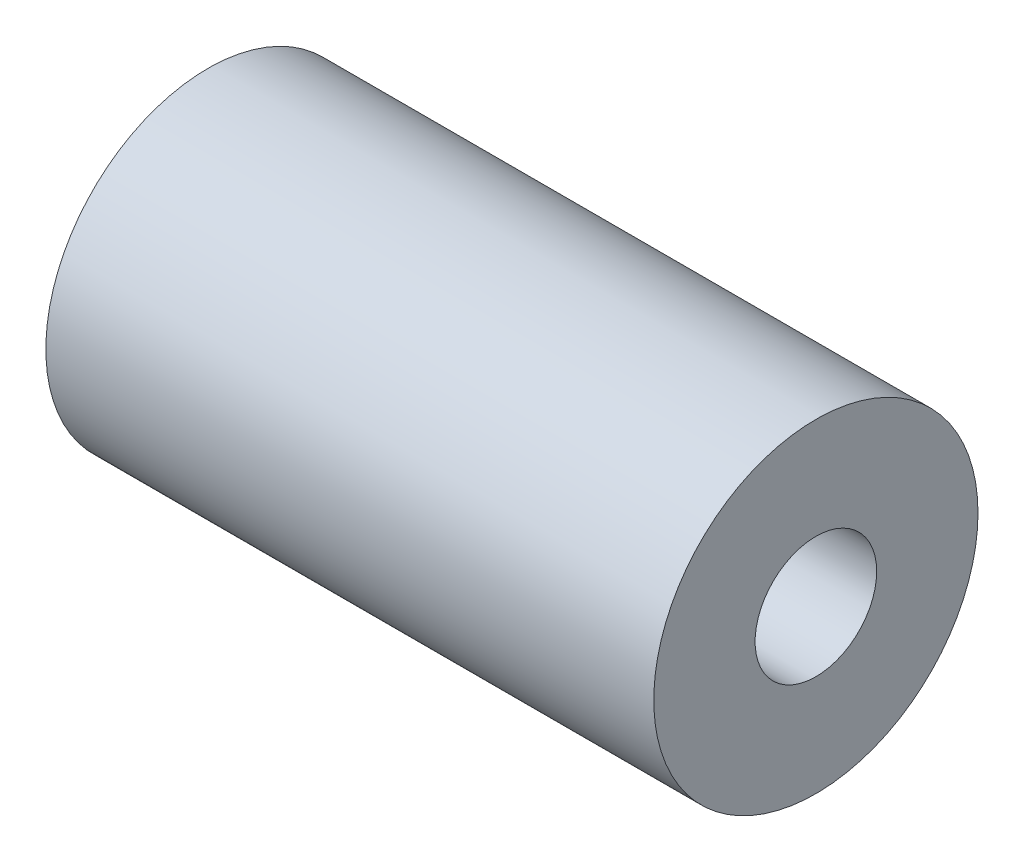
ISO-10303-21;
HEADER;
FILE_DESCRIPTION(('STEP AP214'),'2;1');
FILE_NAME('part.step','',(''),(''),'','','');
FILE_SCHEMA(('AUTOMOTIVE_DESIGN { 1 0 10303 214 1 1 1 1 }'));
ENDSEC;
DATA;
#1=APPLICATION_CONTEXT('core data for automotive mechanical design processes');
#2=APPLICATION_PROTOCOL_DEFINITION('international standard','automotive_design',2000,#1);
#3=PRODUCT_CONTEXT('',#1,'mechanical');
#4=PRODUCT('Part','Part','',(#3));
#5=PRODUCT_RELATED_PRODUCT_CATEGORY('part','',(#4));
#6=PRODUCT_DEFINITION_FORMATION('','',#4);
#7=PRODUCT_DEFINITION_CONTEXT('part definition',#1,'design');
#8=PRODUCT_DEFINITION('design','',#6,#7);
#9=PRODUCT_DEFINITION_SHAPE('','',#8);
#10=(LENGTH_UNIT() NAMED_UNIT(*) SI_UNIT(.MILLI.,.METRE.));
#11=(NAMED_UNIT(*) PLANE_ANGLE_UNIT() SI_UNIT($,.RADIAN.));
#12=(NAMED_UNIT(*) SI_UNIT($,.STERADIAN.) SOLID_ANGLE_UNIT());
#13=UNCERTAINTY_MEASURE_WITH_UNIT(LENGTH_MEASURE(1.E-05),#10,'distance_accuracy_value','');
#14=(GEOMETRIC_REPRESENTATION_CONTEXT(3) GLOBAL_UNCERTAINTY_ASSIGNED_CONTEXT((#13)) GLOBAL_UNIT_ASSIGNED_CONTEXT((#10,
#11,#12)) REPRESENTATION_CONTEXT('',''));
#15=CARTESIAN_POINT('',(0.,0.,0.));
#16=DIRECTION('',(0.,0.,1.));
#17=DIRECTION('',(1.,0.,0.));
#18=AXIS2_PLACEMENT_3D('',#15,#16,#17);
#19=CARTESIAN_POINT('',(15.,0.,0.));
#20=DIRECTION('',(1.,0.,0.));
#21=DIRECTION('',(0.,0.,-1.));
#22=AXIS2_PLACEMENT_3D('',#19,#20,#21);
#23=PLANE('',#22);
#24=CARTESIAN_POINT('',(15.,0.,0.));
#25=DIRECTION('',(1.,0.,0.));
#26=DIRECTION('',(0.,0.,-1.));
#27=AXIS2_PLACEMENT_3D('',#24,#25,#26);
#28=CIRCLE('',#27,4.);
#29=CARTESIAN_POINT('',(15.,0.,-4.));
#30=VERTEX_POINT('',#29);
#31=EDGE_CURVE('E10',#30,#30,#28,.T.);
#32=ORIENTED_EDGE('',*,*,#31,.T.);
#33=EDGE_LOOP('',(#32));
#34=FACE_BOUND('',#33,.T.);
#35=CARTESIAN_POINT('',(15.,0.,0.));
#36=DIRECTION('',(1.,0.,0.));
#37=DIRECTION('',(0.,0.,-1.));
#38=AXIS2_PLACEMENT_3D('',#35,#36,#37);
#39=CIRCLE('',#38,1.5);
#40=CARTESIAN_POINT('',(15.,0.,-1.5));
#41=VERTEX_POINT('',#40);
#42=EDGE_CURVE('E50',#41,#41,#39,.T.);
#43=ORIENTED_EDGE('',*,*,#42,.F.);
#44=EDGE_LOOP('',(#43));
#45=FACE_BOUND('',#44,.T.);
#46=ADVANCED_FACE('F37',(#34,#45),#23,.T.);
#47=CARTESIAN_POINT('',(0.,0.,0.));
#48=DIRECTION('',(1.,0.,0.));
#49=DIRECTION('',(0.,0.,-1.));
#50=AXIS2_PLACEMENT_3D('',#47,#48,#49);
#51=PLANE('',#50);
#52=CARTESIAN_POINT('',(0.,0.,0.));
#53=DIRECTION('',(1.,0.,0.));
#54=DIRECTION('',(0.,0.,-1.));
#55=AXIS2_PLACEMENT_3D('',#52,#53,#54);
#56=CIRCLE('',#55,4.);
#57=CARTESIAN_POINT('',(0.,0.,-4.));
#58=VERTEX_POINT('',#57);
#59=EDGE_CURVE('E41',#58,#58,#56,.T.);
#60=ORIENTED_EDGE('',*,*,#59,.F.);
#61=EDGE_LOOP('',(#60));
#62=FACE_BOUND('',#61,.T.);
#63=CARTESIAN_POINT('',(0.,0.,0.));
#64=DIRECTION('',(1.,0.,0.));
#65=DIRECTION('',(0.,0.,-1.));
#66=AXIS2_PLACEMENT_3D('',#63,#64,#65);
#67=CIRCLE('',#66,1.5);
#68=CARTESIAN_POINT('',(0.,0.,-1.5));
#69=VERTEX_POINT('',#68);
#70=EDGE_CURVE('E52',#69,#69,#67,.T.);
#71=ORIENTED_EDGE('',*,*,#70,.T.);
#72=EDGE_LOOP('',(#71));
#73=FACE_BOUND('',#72,.T.);
#74=ADVANCED_FACE('F64',(#62,#73),#51,.F.);
#75=CARTESIAN_POINT('',(15.,0.,0.));
#76=DIRECTION('',(-1.,0.,0.));
#77=DIRECTION('',(0.,0.,1.));
#78=AXIS2_PLACEMENT_3D('',#75,#76,#77);
#79=CYLINDRICAL_SURFACE('',#78,4.);
#80=ORIENTED_EDGE('',*,*,#31,.F.);
#81=EDGE_LOOP('',(#80));
#82=FACE_BOUND('',#81,.T.);
#83=ORIENTED_EDGE('',*,*,#59,.T.);
#84=EDGE_LOOP('',(#83));
#85=FACE_BOUND('',#84,.T.);
#86=ADVANCED_FACE('F39',(#82,#85),#79,.T.);
#87=CARTESIAN_POINT('',(15.,0.,0.));
#88=DIRECTION('',(-1.,0.,0.));
#89=DIRECTION('',(0.,0.,1.));
#90=AXIS2_PLACEMENT_3D('',#87,#88,#89);
#91=CYLINDRICAL_SURFACE('',#90,1.5);
#92=ORIENTED_EDGE('',*,*,#42,.T.);
#93=EDGE_LOOP('',(#92));
#94=FACE_BOUND('',#93,.T.);
#95=ORIENTED_EDGE('',*,*,#70,.F.);
#96=EDGE_LOOP('',(#95));
#97=FACE_BOUND('',#96,.T.);
#98=ADVANCED_FACE('F60',(#94,#97),#91,.F.);
#99=CLOSED_SHELL('',(#46,#74,#86,#98));
#100=MANIFOLD_SOLID_BREP('B2',#99);
#101=ADVANCED_BREP_SHAPE_REPRESENTATION('',(#18,#100),#14);
#102=SHAPE_DEFINITION_REPRESENTATION(#9,#101);
ENDSEC;
END-ISO-10303-21;
